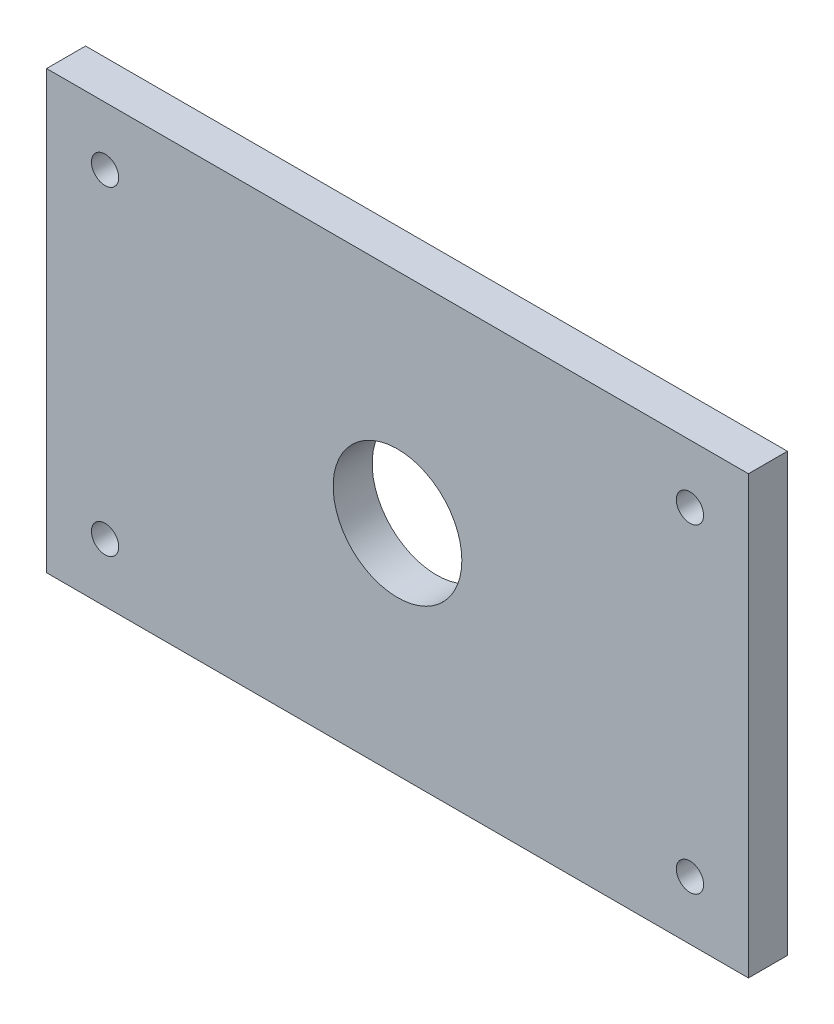
ISO-10303-21;
HEADER;
FILE_DESCRIPTION(('STEP AP214'),'2;1');
FILE_NAME('part.step','',(''),(''),'','','');
FILE_SCHEMA(('AUTOMOTIVE_DESIGN { 1 0 10303 214 1 1 1 1 }'));
ENDSEC;
DATA;
#1=APPLICATION_CONTEXT('core data for automotive mechanical design processes');
#2=APPLICATION_PROTOCOL_DEFINITION('international standard','automotive_design',2000,#1);
#3=PRODUCT_CONTEXT('',#1,'mechanical');
#4=PRODUCT('Part','Part','',(#3));
#5=PRODUCT_RELATED_PRODUCT_CATEGORY('part','',(#4));
#6=PRODUCT_DEFINITION_FORMATION('','',#4);
#7=PRODUCT_DEFINITION_CONTEXT('part definition',#1,'design');
#8=PRODUCT_DEFINITION('design','',#6,#7);
#9=PRODUCT_DEFINITION_SHAPE('','',#8);
#10=(LENGTH_UNIT() NAMED_UNIT(*) SI_UNIT(.MILLI.,.METRE.));
#11=(NAMED_UNIT(*) PLANE_ANGLE_UNIT() SI_UNIT($,.RADIAN.));
#12=(NAMED_UNIT(*) SI_UNIT($,.STERADIAN.) SOLID_ANGLE_UNIT());
#13=UNCERTAINTY_MEASURE_WITH_UNIT(LENGTH_MEASURE(1.E-05),#10,'distance_accuracy_value','');
#14=(GEOMETRIC_REPRESENTATION_CONTEXT(3) GLOBAL_UNCERTAINTY_ASSIGNED_CONTEXT((#13)) GLOBAL_UNIT_ASSIGNED_CONTEXT((#10,
#11,#12)) REPRESENTATION_CONTEXT('',''));
#15=CARTESIAN_POINT('',(0.,0.,0.));
#16=DIRECTION('',(0.,0.,1.));
#17=DIRECTION('',(1.,0.,0.));
#18=AXIS2_PLACEMENT_3D('',#15,#16,#17);
#19=CARTESIAN_POINT('',(0.,0.,5.));
#20=DIRECTION('',(0.,0.,-1.));
#21=DIRECTION('',(-1.,0.,0.));
#22=AXIS2_PLACEMENT_3D('',#19,#20,#21);
#23=PLANE('',#22);
#24=CARTESIAN_POINT('',(0.,0.,5.));
#25=DIRECTION('',(0.,0.,1.));
#26=DIRECTION('',(1.,0.,0.));
#27=AXIS2_PLACEMENT_3D('',#24,#25,#26);
#28=CIRCLE('',#27,8.25);
#29=CARTESIAN_POINT('',(8.25,0.,5.));
#30=VERTEX_POINT('',#29);
#31=EDGE_CURVE('E162',#30,#30,#28,.T.);
#32=ORIENTED_EDGE('',*,*,#31,.F.);
#33=EDGE_LOOP('',(#32));
#34=FACE_BOUND('',#33,.T.);
#35=DIRECTION('',(0.,1.,0.));
#36=VECTOR('',#35,1.);
#37=CARTESIAN_POINT('',(45.,-28.,5.));
#38=LINE('',#37,#36);
#39=CARTESIAN_POINT('',(45.,-28.,5.));
#40=VERTEX_POINT('',#39);
#41=CARTESIAN_POINT('',(45.,28.,5.));
#42=VERTEX_POINT('',#41);
#43=EDGE_CURVE('E92',#40,#42,#38,.T.);
#44=ORIENTED_EDGE('',*,*,#43,.T.);
#45=DIRECTION('',(-1.,0.,0.));
#46=VECTOR('',#45,1.);
#47=CARTESIAN_POINT('',(-45.,28.,5.));
#48=LINE('',#47,#46);
#49=CARTESIAN_POINT('',(-45.,28.,5.));
#50=VERTEX_POINT('',#49);
#51=EDGE_CURVE('E87',#42,#50,#48,.T.);
#52=ORIENTED_EDGE('',*,*,#51,.T.);
#53=DIRECTION('',(0.,-1.,0.));
#54=VECTOR('',#53,1.);
#55=CARTESIAN_POINT('',(-45.,-28.,5.));
#56=LINE('',#55,#54);
#57=CARTESIAN_POINT('',(-45.,-28.,5.));
#58=VERTEX_POINT('',#57);
#59=EDGE_CURVE('E90',#50,#58,#56,.T.);
#60=ORIENTED_EDGE('',*,*,#59,.T.);
#61=DIRECTION('',(1.,0.,0.));
#62=VECTOR('',#61,1.);
#63=CARTESIAN_POINT('',(-45.,-28.,5.));
#64=LINE('',#63,#62);
#65=EDGE_CURVE('E57',#58,#40,#64,.T.);
#66=ORIENTED_EDGE('',*,*,#65,.T.);
#67=EDGE_LOOP('',(#44,#52,#60,#66));
#68=FACE_BOUND('',#67,.T.);
#69=CARTESIAN_POINT('',(-37.5,20.5,5.));
#70=DIRECTION('',(0.,0.,1.));
#71=DIRECTION('',(1.,0.,0.));
#72=AXIS2_PLACEMENT_3D('',#69,#70,#71);
#73=CIRCLE('',#72,1.75);
#74=CARTESIAN_POINT('',(-35.75,20.5,5.));
#75=VERTEX_POINT('',#74);
#76=EDGE_CURVE('E112',#75,#75,#73,.T.);
#77=ORIENTED_EDGE('',*,*,#76,.F.);
#78=EDGE_LOOP('',(#77));
#79=FACE_BOUND('',#78,.T.);
#80=CARTESIAN_POINT('',(37.5,20.5,5.));
#81=DIRECTION('',(0.,0.,1.));
#82=DIRECTION('',(1.,0.,0.));
#83=AXIS2_PLACEMENT_3D('',#80,#81,#82);
#84=CIRCLE('',#83,1.75);
#85=CARTESIAN_POINT('',(39.25,20.5,5.));
#86=VERTEX_POINT('',#85);
#87=EDGE_CURVE('E134',#86,#86,#84,.T.);
#88=ORIENTED_EDGE('',*,*,#87,.F.);
#89=EDGE_LOOP('',(#88));
#90=FACE_BOUND('',#89,.T.);
#91=CARTESIAN_POINT('',(37.5,-20.5,5.));
#92=DIRECTION('',(0.,0.,1.));
#93=DIRECTION('',(1.,0.,0.));
#94=AXIS2_PLACEMENT_3D('',#91,#92,#93);
#95=CIRCLE('',#94,1.75);
#96=CARTESIAN_POINT('',(39.25,-20.5,5.));
#97=VERTEX_POINT('',#96);
#98=EDGE_CURVE('E142',#97,#97,#95,.T.);
#99=ORIENTED_EDGE('',*,*,#98,.F.);
#100=EDGE_LOOP('',(#99));
#101=FACE_BOUND('',#100,.T.);
#102=CARTESIAN_POINT('',(-37.5,-20.5,5.));
#103=DIRECTION('',(0.,0.,1.));
#104=DIRECTION('',(1.,0.,0.));
#105=AXIS2_PLACEMENT_3D('',#102,#103,#104);
#106=CIRCLE('',#105,1.75);
#107=CARTESIAN_POINT('',(-35.75,-20.5,5.));
#108=VERTEX_POINT('',#107);
#109=EDGE_CURVE('E150',#108,#108,#106,.T.);
#110=ORIENTED_EDGE('',*,*,#109,.F.);
#111=EDGE_LOOP('',(#110));
#112=FACE_BOUND('',#111,.T.);
#113=ADVANCED_FACE('F39',(#34,#68,#79,#90,#101,#112),#23,.F.);
#114=CARTESIAN_POINT('',(0.,0.,0.));
#115=DIRECTION('',(0.,0.,-1.));
#116=DIRECTION('',(-1.,0.,0.));
#117=AXIS2_PLACEMENT_3D('',#114,#115,#116);
#118=PLANE('',#117);
#119=CARTESIAN_POINT('',(0.,0.,0.));
#120=DIRECTION('',(0.,0.,1.));
#121=DIRECTION('',(1.,0.,0.));
#122=AXIS2_PLACEMENT_3D('',#119,#120,#121);
#123=CIRCLE('',#122,8.25);
#124=CARTESIAN_POINT('',(8.25,0.,0.));
#125=VERTEX_POINT('',#124);
#126=EDGE_CURVE('E158',#125,#125,#123,.T.);
#127=ORIENTED_EDGE('',*,*,#126,.T.);
#128=EDGE_LOOP('',(#127));
#129=FACE_BOUND('',#128,.T.);
#130=CARTESIAN_POINT('',(37.5,-20.5,0.));
#131=DIRECTION('',(0.,0.,1.));
#132=DIRECTION('',(1.,0.,0.));
#133=AXIS2_PLACEMENT_3D('',#130,#131,#132);
#134=CIRCLE('',#133,1.75);
#135=CARTESIAN_POINT('',(39.25,-20.5,0.));
#136=VERTEX_POINT('',#135);
#137=EDGE_CURVE('E146',#136,#136,#134,.T.);
#138=ORIENTED_EDGE('',*,*,#137,.T.);
#139=EDGE_LOOP('',(#138));
#140=FACE_BOUND('',#139,.T.);
#141=CARTESIAN_POINT('',(-37.5,20.5,0.));
#142=DIRECTION('',(0.,0.,1.));
#143=DIRECTION('',(1.,0.,0.));
#144=AXIS2_PLACEMENT_3D('',#141,#142,#143);
#145=CIRCLE('',#144,1.75);
#146=CARTESIAN_POINT('',(-35.75,20.5,0.));
#147=VERTEX_POINT('',#146);
#148=EDGE_CURVE('E130',#147,#147,#145,.T.);
#149=ORIENTED_EDGE('',*,*,#148,.T.);
#150=EDGE_LOOP('',(#149));
#151=FACE_BOUND('',#150,.T.);
#152=DIRECTION('',(0.,1.,0.));
#153=VECTOR('',#152,1.);
#154=CARTESIAN_POINT('',(45.,-28.,0.));
#155=LINE('',#154,#153);
#156=CARTESIAN_POINT('',(45.,-28.,0.));
#157=VERTEX_POINT('',#156);
#158=CARTESIAN_POINT('',(45.,28.,0.));
#159=VERTEX_POINT('',#158);
#160=EDGE_CURVE('E108',#157,#159,#155,.T.);
#161=ORIENTED_EDGE('',*,*,#160,.F.);
#162=DIRECTION('',(1.,0.,0.));
#163=VECTOR('',#162,1.);
#164=CARTESIAN_POINT('',(-45.,-28.,0.));
#165=LINE('',#164,#163);
#166=CARTESIAN_POINT('',(-45.,-28.,0.));
#167=VERTEX_POINT('',#166);
#168=EDGE_CURVE('E80',#167,#157,#165,.T.);
#169=ORIENTED_EDGE('',*,*,#168,.F.);
#170=DIRECTION('',(0.,-1.,0.));
#171=VECTOR('',#170,1.);
#172=CARTESIAN_POINT('',(-45.,-28.,0.));
#173=LINE('',#172,#171);
#174=CARTESIAN_POINT('',(-45.,28.,0.));
#175=VERTEX_POINT('',#174);
#176=EDGE_CURVE('E74',#175,#167,#173,.T.);
#177=ORIENTED_EDGE('',*,*,#176,.F.);
#178=DIRECTION('',(-1.,0.,0.));
#179=VECTOR('',#178,1.);
#180=CARTESIAN_POINT('',(-45.,28.,0.));
#181=LINE('',#180,#179);
#182=EDGE_CURVE('E97',#159,#175,#181,.T.);
#183=ORIENTED_EDGE('',*,*,#182,.F.);
#184=EDGE_LOOP('',(#161,#169,#177,#183));
#185=FACE_BOUND('',#184,.T.);
#186=CARTESIAN_POINT('',(37.5,20.5,0.));
#187=DIRECTION('',(0.,0.,1.));
#188=DIRECTION('',(1.,0.,0.));
#189=AXIS2_PLACEMENT_3D('',#186,#187,#188);
#190=CIRCLE('',#189,1.75);
#191=CARTESIAN_POINT('',(39.25,20.5,0.));
#192=VERTEX_POINT('',#191);
#193=EDGE_CURVE('E138',#192,#192,#190,.T.);
#194=ORIENTED_EDGE('',*,*,#193,.T.);
#195=EDGE_LOOP('',(#194));
#196=FACE_BOUND('',#195,.T.);
#197=CARTESIAN_POINT('',(-37.5,-20.5,0.));
#198=DIRECTION('',(0.,0.,1.));
#199=DIRECTION('',(1.,0.,0.));
#200=AXIS2_PLACEMENT_3D('',#197,#198,#199);
#201=CIRCLE('',#200,1.75);
#202=CARTESIAN_POINT('',(-35.75,-20.5,0.));
#203=VERTEX_POINT('',#202);
#204=EDGE_CURVE('E154',#203,#203,#201,.T.);
#205=ORIENTED_EDGE('',*,*,#204,.T.);
#206=EDGE_LOOP('',(#205));
#207=FACE_BOUND('',#206,.T.);
#208=ADVANCED_FACE('F125',(#129,#140,#151,#185,#196,#207),#118,.T.);
#209=CARTESIAN_POINT('',(45.,-28.,5.));
#210=DIRECTION('',(-1.,0.,0.));
#211=DIRECTION('',(0.,0.,1.));
#212=AXIS2_PLACEMENT_3D('',#209,#210,#211);
#213=PLANE('',#212);
#214=ORIENTED_EDGE('',*,*,#160,.T.);
#215=DIRECTION('',(0.,0.,-1.));
#216=VECTOR('',#215,1.);
#217=CARTESIAN_POINT('',(45.,28.,5.));
#218=LINE('',#217,#216);
#219=EDGE_CURVE('E11',#42,#159,#218,.T.);
#220=ORIENTED_EDGE('',*,*,#219,.F.);
#221=ORIENTED_EDGE('',*,*,#43,.F.);
#222=DIRECTION('',(0.,0.,-1.));
#223=VECTOR('',#222,1.);
#224=CARTESIAN_POINT('',(45.,-28.,5.));
#225=LINE('',#224,#223);
#226=EDGE_CURVE('E104',#40,#157,#225,.T.);
#227=ORIENTED_EDGE('',*,*,#226,.T.);
#228=EDGE_LOOP('',(#214,#220,#221,#227));
#229=FACE_BOUND('',#228,.T.);
#230=ADVANCED_FACE('F41',(#229),#213,.F.);
#231=CARTESIAN_POINT('',(-45.,28.,5.));
#232=DIRECTION('',(0.,-1.,0.));
#233=DIRECTION('',(1.,0.,0.));
#234=AXIS2_PLACEMENT_3D('',#231,#232,#233);
#235=PLANE('',#234);
#236=ORIENTED_EDGE('',*,*,#182,.T.);
#237=DIRECTION('',(0.,0.,-1.));
#238=VECTOR('',#237,1.);
#239=CARTESIAN_POINT('',(-45.,28.,5.));
#240=LINE('',#239,#238);
#241=EDGE_CURVE('E49',#50,#175,#240,.T.);
#242=ORIENTED_EDGE('',*,*,#241,.F.);
#243=ORIENTED_EDGE('',*,*,#51,.F.);
#244=ORIENTED_EDGE('',*,*,#219,.T.);
#245=EDGE_LOOP('',(#236,#242,#243,#244));
#246=FACE_BOUND('',#245,.T.);
#247=ADVANCED_FACE('F96',(#246),#235,.F.);
#248=CARTESIAN_POINT('',(-45.,-28.,5.));
#249=DIRECTION('',(1.,0.,0.));
#250=DIRECTION('',(0.,0.,-1.));
#251=AXIS2_PLACEMENT_3D('',#248,#249,#250);
#252=PLANE('',#251);
#253=ORIENTED_EDGE('',*,*,#176,.T.);
#254=DIRECTION('',(0.,0.,-1.));
#255=VECTOR('',#254,1.);
#256=CARTESIAN_POINT('',(-45.,-28.,5.));
#257=LINE('',#256,#255);
#258=EDGE_CURVE('E99',#58,#167,#257,.T.);
#259=ORIENTED_EDGE('',*,*,#258,.F.);
#260=ORIENTED_EDGE('',*,*,#59,.F.);
#261=ORIENTED_EDGE('',*,*,#241,.T.);
#262=EDGE_LOOP('',(#253,#259,#260,#261));
#263=FACE_BOUND('',#262,.T.);
#264=ADVANCED_FACE('F100',(#263),#252,.F.);
#265=CARTESIAN_POINT('',(-45.,-28.,5.));
#266=DIRECTION('',(0.,1.,0.));
#267=DIRECTION('',(-1.,0.,0.));
#268=AXIS2_PLACEMENT_3D('',#265,#266,#267);
#269=PLANE('',#268);
#270=ORIENTED_EDGE('',*,*,#168,.T.);
#271=ORIENTED_EDGE('',*,*,#226,.F.);
#272=ORIENTED_EDGE('',*,*,#65,.F.);
#273=ORIENTED_EDGE('',*,*,#258,.T.);
#274=EDGE_LOOP('',(#270,#271,#272,#273));
#275=FACE_BOUND('',#274,.T.);
#276=ADVANCED_FACE('F122',(#275),#269,.F.);
#277=CARTESIAN_POINT('',(-37.5,20.5,5.));
#278=DIRECTION('',(0.,0.,-1.));
#279=DIRECTION('',(-1.,0.,0.));
#280=AXIS2_PLACEMENT_3D('',#277,#278,#279);
#281=CYLINDRICAL_SURFACE('',#280,1.75);
#282=ORIENTED_EDGE('',*,*,#76,.T.);
#283=EDGE_LOOP('',(#282));
#284=FACE_BOUND('',#283,.T.);
#285=ORIENTED_EDGE('',*,*,#148,.F.);
#286=EDGE_LOOP('',(#285));
#287=FACE_BOUND('',#286,.T.);
#288=ADVANCED_FACE('F186',(#284,#287),#281,.F.);
#289=CARTESIAN_POINT('',(37.5,20.5,5.));
#290=DIRECTION('',(0.,0.,-1.));
#291=DIRECTION('',(-1.,0.,0.));
#292=AXIS2_PLACEMENT_3D('',#289,#290,#291);
#293=CYLINDRICAL_SURFACE('',#292,1.75);
#294=ORIENTED_EDGE('',*,*,#87,.T.);
#295=EDGE_LOOP('',(#294));
#296=FACE_BOUND('',#295,.T.);
#297=ORIENTED_EDGE('',*,*,#193,.F.);
#298=EDGE_LOOP('',(#297));
#299=FACE_BOUND('',#298,.T.);
#300=ADVANCED_FACE('F226',(#296,#299),#293,.F.);
#301=CARTESIAN_POINT('',(37.5,-20.5,5.));
#302=DIRECTION('',(0.,0.,-1.));
#303=DIRECTION('',(-1.,0.,0.));
#304=AXIS2_PLACEMENT_3D('',#301,#302,#303);
#305=CYLINDRICAL_SURFACE('',#304,1.75);
#306=ORIENTED_EDGE('',*,*,#98,.T.);
#307=EDGE_LOOP('',(#306));
#308=FACE_BOUND('',#307,.T.);
#309=ORIENTED_EDGE('',*,*,#137,.F.);
#310=EDGE_LOOP('',(#309));
#311=FACE_BOUND('',#310,.T.);
#312=ADVANCED_FACE('F219',(#308,#311),#305,.F.);
#313=CARTESIAN_POINT('',(-37.5,-20.5,5.));
#314=DIRECTION('',(0.,0.,-1.));
#315=DIRECTION('',(-1.,0.,0.));
#316=AXIS2_PLACEMENT_3D('',#313,#314,#315);
#317=CYLINDRICAL_SURFACE('',#316,1.75);
#318=ORIENTED_EDGE('',*,*,#109,.T.);
#319=EDGE_LOOP('',(#318));
#320=FACE_BOUND('',#319,.T.);
#321=ORIENTED_EDGE('',*,*,#204,.F.);
#322=EDGE_LOOP('',(#321));
#323=FACE_BOUND('',#322,.T.);
#324=ADVANCED_FACE('F175',(#320,#323),#317,.F.);
#325=CARTESIAN_POINT('',(0.,0.,0.));
#326=DIRECTION('',(0.,0.,1.));
#327=DIRECTION('',(1.,0.,0.));
#328=AXIS2_PLACEMENT_3D('',#325,#326,#327);
#329=CYLINDRICAL_SURFACE('',#328,8.25);
#330=ORIENTED_EDGE('',*,*,#126,.F.);
#331=EDGE_LOOP('',(#330));
#332=FACE_BOUND('',#331,.T.);
#333=ORIENTED_EDGE('',*,*,#31,.T.);
#334=EDGE_LOOP('',(#333));
#335=FACE_BOUND('',#334,.T.);
#336=ADVANCED_FACE('F172',(#332,#335),#329,.F.);
#337=CLOSED_SHELL('',(#113,#208,#230,#247,#264,#276,#288,#300,#312,#324,#336));
#338=MANIFOLD_SOLID_BREP('B2',#337);
#339=ADVANCED_BREP_SHAPE_REPRESENTATION('',(#18,#338),#14);
#340=SHAPE_DEFINITION_REPRESENTATION(#9,#339);
ENDSEC;
END-ISO-10303-21;
